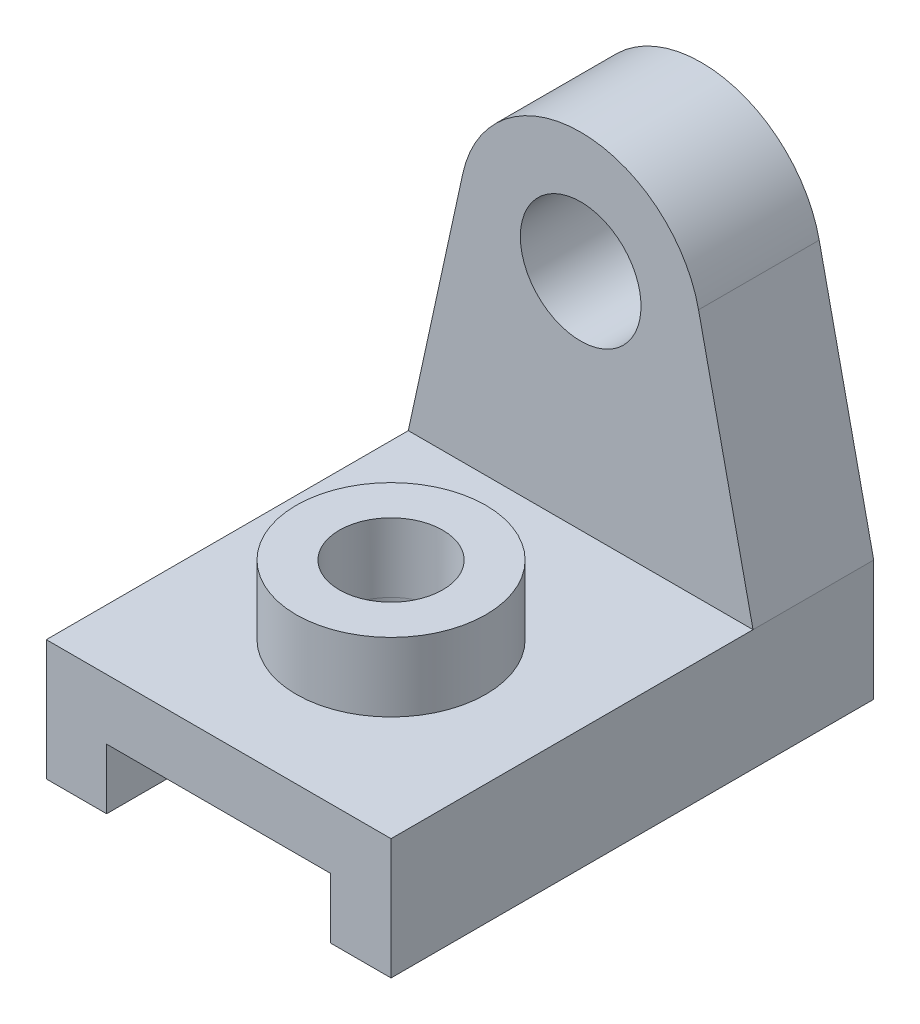
ISO-10303-21;
HEADER;
FILE_DESCRIPTION(('STEP AP214'),'2;1');
FILE_NAME('part.step','',(''),(''),'','','');
FILE_SCHEMA(('AUTOMOTIVE_DESIGN { 1 0 10303 214 1 1 1 1 }'));
ENDSEC;
DATA;
#1=APPLICATION_CONTEXT('core data for automotive mechanical design processes');
#2=APPLICATION_PROTOCOL_DEFINITION('international standard','automotive_design',2000,#1);
#3=PRODUCT_CONTEXT('',#1,'mechanical');
#4=PRODUCT('Part','Part','',(#3));
#5=PRODUCT_RELATED_PRODUCT_CATEGORY('part','',(#4));
#6=PRODUCT_DEFINITION_FORMATION('','',#4);
#7=PRODUCT_DEFINITION_CONTEXT('part definition',#1,'design');
#8=PRODUCT_DEFINITION('design','',#6,#7);
#9=PRODUCT_DEFINITION_SHAPE('','',#8);
#10=(LENGTH_UNIT() NAMED_UNIT(*) SI_UNIT(.MILLI.,.METRE.));
#11=(NAMED_UNIT(*) PLANE_ANGLE_UNIT() SI_UNIT($,.RADIAN.));
#12=(NAMED_UNIT(*) SI_UNIT($,.STERADIAN.) SOLID_ANGLE_UNIT());
#13=UNCERTAINTY_MEASURE_WITH_UNIT(LENGTH_MEASURE(1.E-05),#10,'distance_accuracy_value','');
#14=(GEOMETRIC_REPRESENTATION_CONTEXT(3) GLOBAL_UNCERTAINTY_ASSIGNED_CONTEXT((#13)) GLOBAL_UNIT_ASSIGNED_CONTEXT((#10,
#11,#12)) REPRESENTATION_CONTEXT('',''));
#15=CARTESIAN_POINT('',(0.,0.,0.));
#16=DIRECTION('',(0.,0.,1.));
#17=DIRECTION('',(1.,0.,0.));
#18=AXIS2_PLACEMENT_3D('',#15,#16,#17);
#19=CARTESIAN_POINT('',(20.,0.,-56.));
#20=DIRECTION('',(1.,0.,0.));
#21=DIRECTION('',(0.,0.,-1.));
#22=AXIS2_PLACEMENT_3D('',#19,#20,#21);
#23=PLANE('',#22);
#24=DIRECTION('',(0.,1.,0.));
#25=VECTOR('',#24,1.);
#26=CARTESIAN_POINT('',(20.,0.,0.));
#27=LINE('',#26,#25);
#28=CARTESIAN_POINT('',(20.,-14.,0.));
#29=VERTEX_POINT('',#28);
#30=CARTESIAN_POINT('',(20.,0.,0.));
#31=VERTEX_POINT('',#30);
#32=EDGE_CURVE('E179',#29,#31,#27,.T.);
#33=ORIENTED_EDGE('',*,*,#32,.F.);
#34=DIRECTION('',(0.,0.,1.));
#35=VECTOR('',#34,1.);
#36=CARTESIAN_POINT('',(20.,-14.,-56.));
#37=LINE('',#36,#35);
#38=CARTESIAN_POINT('',(20.,-14.,-56.));
#39=VERTEX_POINT('',#38);
#40=EDGE_CURVE('E45',#39,#29,#37,.T.);
#41=ORIENTED_EDGE('',*,*,#40,.F.);
#42=DIRECTION('',(0.,1.,0.));
#43=VECTOR('',#42,1.);
#44=CARTESIAN_POINT('',(20.,0.,-56.));
#45=LINE('',#44,#43);
#46=CARTESIAN_POINT('',(20.,0.,-56.));
#47=VERTEX_POINT('',#46);
#48=EDGE_CURVE('E128',#39,#47,#45,.T.);
#49=ORIENTED_EDGE('',*,*,#48,.T.);
#50=DIRECTION('',(0.,0.,1.));
#51=VECTOR('',#50,1.);
#52=CARTESIAN_POINT('',(20.,0.,-56.));
#53=LINE('',#52,#51);
#54=CARTESIAN_POINT('',(20.,0.,-42.));
#55=VERTEX_POINT('',#54);
#56=EDGE_CURVE('E123',#47,#55,#53,.T.);
#57=ORIENTED_EDGE('',*,*,#56,.T.);
#58=EDGE_CURVE('E125',#55,#31,#53,.T.);
#59=ORIENTED_EDGE('',*,*,#58,.T.);
#60=EDGE_LOOP('',(#33,#41,#49,#57,#59));
#61=FACE_BOUND('',#60,.T.);
#62=ADVANCED_FACE('F37',(#61),#23,.T.);
#63=CARTESIAN_POINT('',(20.,-14.,-56.));
#64=DIRECTION('',(0.,-1.,0.));
#65=DIRECTION('',(0.,0.,-1.));
#66=AXIS2_PLACEMENT_3D('',#63,#64,#65);
#67=PLANE('',#66);
#68=DIRECTION('',(1.,0.,0.));
#69=VECTOR('',#68,1.);
#70=CARTESIAN_POINT('',(20.,-14.,0.));
#71=LINE('',#70,#69);
#72=CARTESIAN_POINT('',(13.,-14.,0.));
#73=VERTEX_POINT('',#72);
#74=EDGE_CURVE('E183',#73,#29,#71,.T.);
#75=ORIENTED_EDGE('',*,*,#74,.F.);
#76=DIRECTION('',(0.,0.,1.));
#77=VECTOR('',#76,1.);
#78=CARTESIAN_POINT('',(13.,-14.,-56.));
#79=LINE('',#78,#77);
#80=CARTESIAN_POINT('',(13.,-14.,-56.));
#81=VERTEX_POINT('',#80);
#82=EDGE_CURVE('E220',#81,#73,#79,.T.);
#83=ORIENTED_EDGE('',*,*,#82,.F.);
#84=DIRECTION('',(1.,0.,0.));
#85=VECTOR('',#84,1.);
#86=CARTESIAN_POINT('',(20.,-14.,-56.));
#87=LINE('',#86,#85);
#88=EDGE_CURVE('E139',#81,#39,#87,.T.);
#89=ORIENTED_EDGE('',*,*,#88,.T.);
#90=ORIENTED_EDGE('',*,*,#40,.T.);
#91=EDGE_LOOP('',(#75,#83,#89,#90));
#92=FACE_BOUND('',#91,.T.);
#93=ADVANCED_FACE('F245',(#92),#67,.T.);
#94=CARTESIAN_POINT('',(13.,-14.,-56.));
#95=DIRECTION('',(-1.,0.,0.));
#96=DIRECTION('',(0.,0.,1.));
#97=AXIS2_PLACEMENT_3D('',#94,#95,#96);
#98=PLANE('',#97);
#99=DIRECTION('',(0.,-1.,0.));
#100=VECTOR('',#99,1.);
#101=CARTESIAN_POINT('',(13.,-14.,0.));
#102=LINE('',#101,#100);
#103=CARTESIAN_POINT('',(13.,-7.,0.));
#104=VERTEX_POINT('',#103);
#105=EDGE_CURVE('E214',#104,#73,#102,.T.);
#106=ORIENTED_EDGE('',*,*,#105,.F.);
#107=DIRECTION('',(0.,0.,1.));
#108=VECTOR('',#107,1.);
#109=CARTESIAN_POINT('',(13.,-7.,-56.));
#110=LINE('',#109,#108);
#111=CARTESIAN_POINT('',(13.,-7.,-56.));
#112=VERTEX_POINT('',#111);
#113=EDGE_CURVE('E222',#112,#104,#110,.T.);
#114=ORIENTED_EDGE('',*,*,#113,.F.);
#115=DIRECTION('',(0.,-1.,0.));
#116=VECTOR('',#115,1.);
#117=CARTESIAN_POINT('',(13.,-14.,-56.));
#118=LINE('',#117,#116);
#119=EDGE_CURVE('E195',#112,#81,#118,.T.);
#120=ORIENTED_EDGE('',*,*,#119,.T.);
#121=ORIENTED_EDGE('',*,*,#82,.T.);
#122=EDGE_LOOP('',(#106,#114,#120,#121));
#123=FACE_BOUND('',#122,.T.);
#124=ADVANCED_FACE('F248',(#123),#98,.T.);
#125=CARTESIAN_POINT('',(13.,-7.,-56.));
#126=DIRECTION('',(0.,-1.,0.));
#127=DIRECTION('',(0.,0.,-1.));
#128=AXIS2_PLACEMENT_3D('',#125,#126,#127);
#129=PLANE('',#128);
#130=CARTESIAN_POINT('',(0.,-7.,-19.9942415105449));
#131=DIRECTION('',(0.,-1.,0.));
#132=DIRECTION('',(0.,0.,-1.));
#133=AXIS2_PLACEMENT_3D('',#130,#131,#132);
#134=CIRCLE('',#133,6.00575848945509);
#135=CARTESIAN_POINT('',(0.,-7.,-26.));
#136=VERTEX_POINT('',#135);
#137=EDGE_CURVE('E40',#136,#136,#134,.T.);
#138=ORIENTED_EDGE('',*,*,#137,.F.);
#139=EDGE_LOOP('',(#138));
#140=FACE_BOUND('',#139,.T.);
#141=DIRECTION('',(1.,0.,0.));
#142=VECTOR('',#141,1.);
#143=CARTESIAN_POINT('',(13.,-7.,0.));
#144=LINE('',#143,#142);
#145=CARTESIAN_POINT('',(-13.,-7.,0.));
#146=VERTEX_POINT('',#145);
#147=EDGE_CURVE('E211',#146,#104,#144,.T.);
#148=ORIENTED_EDGE('',*,*,#147,.F.);
#149=DIRECTION('',(0.,0.,1.));
#150=VECTOR('',#149,1.);
#151=CARTESIAN_POINT('',(-13.,-7.,-56.));
#152=LINE('',#151,#150);
#153=CARTESIAN_POINT('',(-13.,-7.,-56.));
#154=VERTEX_POINT('',#153);
#155=EDGE_CURVE('E224',#154,#146,#152,.T.);
#156=ORIENTED_EDGE('',*,*,#155,.F.);
#157=DIRECTION('',(1.,0.,0.));
#158=VECTOR('',#157,1.);
#159=CARTESIAN_POINT('',(13.,-7.,-56.));
#160=LINE('',#159,#158);
#161=EDGE_CURVE('E192',#154,#112,#160,.T.);
#162=ORIENTED_EDGE('',*,*,#161,.T.);
#163=ORIENTED_EDGE('',*,*,#113,.T.);
#164=EDGE_LOOP('',(#148,#156,#162,#163));
#165=FACE_BOUND('',#164,.T.);
#166=ADVANCED_FACE('F253',(#140,#165),#129,.T.);
#167=CARTESIAN_POINT('',(-13.,-14.,-56.));
#168=DIRECTION('',(1.,0.,0.));
#169=DIRECTION('',(0.,0.,-1.));
#170=AXIS2_PLACEMENT_3D('',#167,#168,#169);
#171=PLANE('',#170);
#172=DIRECTION('',(0.,1.,0.));
#173=VECTOR('',#172,1.);
#174=CARTESIAN_POINT('',(-13.,-14.,0.));
#175=LINE('',#174,#173);
#176=CARTESIAN_POINT('',(-13.,-14.,0.));
#177=VERTEX_POINT('',#176);
#178=EDGE_CURVE('E208',#177,#146,#175,.T.);
#179=ORIENTED_EDGE('',*,*,#178,.F.);
#180=DIRECTION('',(0.,0.,1.));
#181=VECTOR('',#180,1.);
#182=CARTESIAN_POINT('',(-13.,-14.,-56.));
#183=LINE('',#182,#181);
#184=CARTESIAN_POINT('',(-13.,-14.,-56.));
#185=VERTEX_POINT('',#184);
#186=EDGE_CURVE('E226',#185,#177,#183,.T.);
#187=ORIENTED_EDGE('',*,*,#186,.F.);
#188=DIRECTION('',(0.,1.,0.));
#189=VECTOR('',#188,1.);
#190=CARTESIAN_POINT('',(-13.,-14.,-56.));
#191=LINE('',#190,#189);
#192=EDGE_CURVE('E189',#185,#154,#191,.T.);
#193=ORIENTED_EDGE('',*,*,#192,.T.);
#194=ORIENTED_EDGE('',*,*,#155,.T.);
#195=EDGE_LOOP('',(#179,#187,#193,#194));
#196=FACE_BOUND('',#195,.T.);
#197=ADVANCED_FACE('F256',(#196),#171,.T.);
#198=CARTESIAN_POINT('',(-20.,-14.,-56.));
#199=DIRECTION('',(0.,-1.,0.));
#200=DIRECTION('',(0.,0.,-1.));
#201=AXIS2_PLACEMENT_3D('',#198,#199,#200);
#202=PLANE('',#201);
#203=DIRECTION('',(1.,0.,0.));
#204=VECTOR('',#203,1.);
#205=CARTESIAN_POINT('',(-20.,-14.,0.));
#206=LINE('',#205,#204);
#207=CARTESIAN_POINT('',(-20.,-14.,0.));
#208=VERTEX_POINT('',#207);
#209=EDGE_CURVE('E205',#208,#177,#206,.T.);
#210=ORIENTED_EDGE('',*,*,#209,.F.);
#211=DIRECTION('',(0.,0.,1.));
#212=VECTOR('',#211,1.);
#213=CARTESIAN_POINT('',(-20.,-14.,-56.));
#214=LINE('',#213,#212);
#215=CARTESIAN_POINT('',(-20.,-14.,-56.));
#216=VERTEX_POINT('',#215);
#217=EDGE_CURVE('E228',#216,#208,#214,.T.);
#218=ORIENTED_EDGE('',*,*,#217,.F.);
#219=DIRECTION('',(1.,0.,0.));
#220=VECTOR('',#219,1.);
#221=CARTESIAN_POINT('',(-20.,-14.,-56.));
#222=LINE('',#221,#220);
#223=EDGE_CURVE('E186',#216,#185,#222,.T.);
#224=ORIENTED_EDGE('',*,*,#223,.T.);
#225=ORIENTED_EDGE('',*,*,#186,.T.);
#226=EDGE_LOOP('',(#210,#218,#224,#225));
#227=FACE_BOUND('',#226,.T.);
#228=ADVANCED_FACE('F260',(#227),#202,.T.);
#229=CARTESIAN_POINT('',(-20.,0.,-56.));
#230=DIRECTION('',(-1.,0.,0.));
#231=DIRECTION('',(0.,0.,1.));
#232=AXIS2_PLACEMENT_3D('',#229,#230,#231);
#233=PLANE('',#232);
#234=DIRECTION('',(0.,-1.,0.));
#235=VECTOR('',#234,1.);
#236=CARTESIAN_POINT('',(-20.,0.,0.));
#237=LINE('',#236,#235);
#238=CARTESIAN_POINT('',(-20.,0.,0.));
#239=VERTEX_POINT('',#238);
#240=EDGE_CURVE('E202',#239,#208,#237,.T.);
#241=ORIENTED_EDGE('',*,*,#240,.F.);
#242=DIRECTION('',(0.,0.,1.));
#243=VECTOR('',#242,1.);
#244=CARTESIAN_POINT('',(-20.,0.,-56.));
#245=LINE('',#244,#243);
#246=CARTESIAN_POINT('',(-20.,0.,-42.));
#247=VERTEX_POINT('',#246);
#248=EDGE_CURVE('E133',#247,#239,#245,.T.);
#249=ORIENTED_EDGE('',*,*,#248,.F.);
#250=CARTESIAN_POINT('',(-20.,0.,-56.));
#251=VERTEX_POINT('',#250);
#252=EDGE_CURVE('E230',#251,#247,#245,.T.);
#253=ORIENTED_EDGE('',*,*,#252,.F.);
#254=DIRECTION('',(0.,-1.,0.));
#255=VECTOR('',#254,1.);
#256=CARTESIAN_POINT('',(-20.,0.,-56.));
#257=LINE('',#256,#255);
#258=EDGE_CURVE('E182',#251,#216,#257,.T.);
#259=ORIENTED_EDGE('',*,*,#258,.T.);
#260=ORIENTED_EDGE('',*,*,#217,.T.);
#261=EDGE_LOOP('',(#241,#249,#253,#259,#260));
#262=FACE_BOUND('',#261,.T.);
#263=ADVANCED_FACE('F234',(#262),#233,.T.);
#264=CARTESIAN_POINT('',(-20.,0.,-56.));
#265=DIRECTION('',(0.,1.,0.));
#266=DIRECTION('',(0.,0.,1.));
#267=AXIS2_PLACEMENT_3D('',#264,#265,#266);
#268=PLANE('',#267);
#269=CARTESIAN_POINT('',(0.,0.,-20.));
#270=DIRECTION('',(0.,1.,0.));
#271=DIRECTION('',(0.,0.,1.));
#272=AXIS2_PLACEMENT_3D('',#269,#270,#271);
#273=CIRCLE('',#272,11.);
#274=CARTESIAN_POINT('',(0.,0.,-9.));
#275=VERTEX_POINT('',#274);
#276=EDGE_CURVE('E160',#275,#275,#273,.T.);
#277=ORIENTED_EDGE('',*,*,#276,.F.);
#278=EDGE_LOOP('',(#277));
#279=FACE_BOUND('',#278,.T.);
#280=DIRECTION('',(1.,0.,0.));
#281=VECTOR('',#280,1.);
#282=CARTESIAN_POINT('',(0.,0.,-42.));
#283=LINE('',#282,#281);
#284=EDGE_CURVE('E58',#247,#55,#283,.T.);
#285=ORIENTED_EDGE('',*,*,#284,.F.);
#286=ORIENTED_EDGE('',*,*,#248,.T.);
#287=DIRECTION('',(-1.,0.,0.));
#288=VECTOR('',#287,1.);
#289=CARTESIAN_POINT('',(-20.,0.,0.));
#290=LINE('',#289,#288);
#291=EDGE_CURVE('E137',#31,#239,#290,.T.);
#292=ORIENTED_EDGE('',*,*,#291,.F.);
#293=ORIENTED_EDGE('',*,*,#58,.F.);
#294=EDGE_LOOP('',(#285,#286,#292,#293));
#295=FACE_BOUND('',#294,.T.);
#296=ADVANCED_FACE('F135',(#279,#295),#268,.T.);
#297=CARTESIAN_POINT('',(0.,0.,-56.));
#298=DIRECTION('',(0.,0.,-1.));
#299=DIRECTION('',(-1.,0.,0.));
#300=AXIS2_PLACEMENT_3D('',#297,#298,#299);
#301=PLANE('',#300);
#302=ORIENTED_EDGE('',*,*,#48,.F.);
#303=ORIENTED_EDGE('',*,*,#88,.F.);
#304=ORIENTED_EDGE('',*,*,#119,.F.);
#305=ORIENTED_EDGE('',*,*,#161,.F.);
#306=ORIENTED_EDGE('',*,*,#192,.F.);
#307=ORIENTED_EDGE('',*,*,#223,.F.);
#308=ORIENTED_EDGE('',*,*,#258,.F.);
#309=DIRECTION('',(-0.213100259263618,-0.977030337042704,0.));
#310=VECTOR('',#309,1.);
#311=CARTESIAN_POINT('',(-19.0917655900356,4.1641083626444,-56.));
#312=LINE('',#311,#310);
#313=CARTESIAN_POINT('',(-13.6784247185978,28.9834036296907,-56.));
#314=VERTEX_POINT('',#313);
#315=EDGE_CURVE('E172',#314,#251,#312,.T.);
#316=ORIENTED_EDGE('',*,*,#315,.F.);
#317=CARTESIAN_POINT('',(0.,26.,-56.));
#318=DIRECTION('',(0.,0.,-1.));
#319=DIRECTION('',(-1.,0.,0.));
#320=AXIS2_PLACEMENT_3D('',#317,#318,#319);
#321=CIRCLE('',#320,14.);
#322=CARTESIAN_POINT('',(13.6784247185979,28.9834036296907,-56.));
#323=VERTEX_POINT('',#322);
#324=EDGE_CURVE('E157',#314,#323,#321,.T.);
#325=ORIENTED_EDGE('',*,*,#324,.T.);
#326=DIRECTION('',(0.213100259263618,-0.977030337042704,0.));
#327=VECTOR('',#326,1.);
#328=CARTESIAN_POINT('',(19.0917655900356,4.1641083626444,-56.));
#329=LINE('',#328,#327);
#330=EDGE_CURVE('E170',#323,#47,#329,.T.);
#331=ORIENTED_EDGE('',*,*,#330,.T.);
#332=EDGE_LOOP('',(#302,#303,#304,#305,#306,#307,#308,#316,#325,#331));
#333=FACE_BOUND('',#332,.T.);
#334=CARTESIAN_POINT('',(0.,26.,-56.));
#335=DIRECTION('',(0.,0.,-1.));
#336=DIRECTION('',(-1.,0.,0.));
#337=AXIS2_PLACEMENT_3D('',#334,#335,#336);
#338=CIRCLE('',#337,7.);
#339=CARTESIAN_POINT('',(-7.,26.,-56.));
#340=VERTEX_POINT('',#339);
#341=EDGE_CURVE('E154',#340,#340,#338,.T.);
#342=ORIENTED_EDGE('',*,*,#341,.F.);
#343=EDGE_LOOP('',(#342));
#344=FACE_BOUND('',#343,.T.);
#345=ADVANCED_FACE('F242',(#333,#344),#301,.T.);
#346=CARTESIAN_POINT('',(0.,0.,0.));
#347=DIRECTION('',(0.,0.,-1.));
#348=DIRECTION('',(-1.,0.,0.));
#349=AXIS2_PLACEMENT_3D('',#346,#347,#348);
#350=PLANE('',#349);
#351=ORIENTED_EDGE('',*,*,#32,.T.);
#352=ORIENTED_EDGE('',*,*,#291,.T.);
#353=ORIENTED_EDGE('',*,*,#240,.T.);
#354=ORIENTED_EDGE('',*,*,#209,.T.);
#355=ORIENTED_EDGE('',*,*,#178,.T.);
#356=ORIENTED_EDGE('',*,*,#147,.T.);
#357=ORIENTED_EDGE('',*,*,#105,.T.);
#358=ORIENTED_EDGE('',*,*,#74,.T.);
#359=EDGE_LOOP('',(#351,#352,#353,#354,#355,#356,#357,#358));
#360=FACE_BOUND('',#359,.T.);
#361=ADVANCED_FACE('F237',(#360),#350,.F.);
#362=CARTESIAN_POINT('',(19.0917655900356,4.1641083626444,-42.));
#363=DIRECTION('',(0.977030337042703,0.213100259263618,0.));
#364=DIRECTION('',(-0.213100259263618,0.977030337042704,0.));
#365=AXIS2_PLACEMENT_3D('',#362,#363,#364);
#366=PLANE('',#365);
#367=ORIENTED_EDGE('',*,*,#330,.F.);
#368=DIRECTION('',(0.,0.,-1.));
#369=VECTOR('',#368,1.);
#370=CARTESIAN_POINT('',(13.6784247185979,28.9834036296907,-42.));
#371=LINE('',#370,#369);
#372=CARTESIAN_POINT('',(13.6784247185979,28.9834036296907,-42.));
#373=VERTEX_POINT('',#372);
#374=EDGE_CURVE('E153',#373,#323,#371,.T.);
#375=ORIENTED_EDGE('',*,*,#374,.F.);
#376=DIRECTION('',(0.213100259263618,-0.977030337042704,0.));
#377=VECTOR('',#376,1.);
#378=CARTESIAN_POINT('',(19.0917655900356,4.1641083626444,-42.));
#379=LINE('',#378,#377);
#380=EDGE_CURVE('E146',#373,#55,#379,.T.);
#381=ORIENTED_EDGE('',*,*,#380,.T.);
#382=ORIENTED_EDGE('',*,*,#56,.F.);
#383=EDGE_LOOP('',(#367,#375,#381,#382));
#384=FACE_BOUND('',#383,.T.);
#385=ADVANCED_FACE('F152',(#384),#366,.T.);
#386=CARTESIAN_POINT('',(0.,26.,-42.));
#387=DIRECTION('',(0.,0.,-1.));
#388=DIRECTION('',(-1.,0.,0.));
#389=AXIS2_PLACEMENT_3D('',#386,#387,#388);
#390=CYLINDRICAL_SURFACE('',#389,14.);
#391=ORIENTED_EDGE('',*,*,#324,.F.);
#392=DIRECTION('',(0.,0.,-1.));
#393=VECTOR('',#392,1.);
#394=CARTESIAN_POINT('',(-13.6784247185978,28.9834036296907,-42.));
#395=LINE('',#394,#393);
#396=CARTESIAN_POINT('',(-13.6784247185978,28.9834036296907,-42.));
#397=VERTEX_POINT('',#396);
#398=EDGE_CURVE('E169',#397,#314,#395,.T.);
#399=ORIENTED_EDGE('',*,*,#398,.F.);
#400=CARTESIAN_POINT('',(0.,26.,-42.));
#401=DIRECTION('',(0.,0.,-1.));
#402=DIRECTION('',(-1.,0.,0.));
#403=AXIS2_PLACEMENT_3D('',#400,#401,#402);
#404=CIRCLE('',#403,14.);
#405=EDGE_CURVE('E164',#397,#373,#404,.T.);
#406=ORIENTED_EDGE('',*,*,#405,.T.);
#407=ORIENTED_EDGE('',*,*,#374,.T.);
#408=EDGE_LOOP('',(#391,#399,#406,#407));
#409=FACE_BOUND('',#408,.T.);
#410=ADVANCED_FACE('F311',(#409),#390,.T.);
#411=CARTESIAN_POINT('',(-19.0917655900356,4.1641083626444,-42.));
#412=DIRECTION('',(0.977030337042703,-0.213100259263618,0.));
#413=DIRECTION('',(0.213100259263618,0.977030337042704,0.));
#414=AXIS2_PLACEMENT_3D('',#411,#412,#413);
#415=PLANE('',#414);
#416=ORIENTED_EDGE('',*,*,#315,.T.);
#417=ORIENTED_EDGE('',*,*,#252,.T.);
#418=DIRECTION('',(-0.213100259263618,-0.977030337042704,0.));
#419=VECTOR('',#418,1.);
#420=CARTESIAN_POINT('',(-19.0917655900356,4.1641083626444,-42.));
#421=LINE('',#420,#419);
#422=EDGE_CURVE('E149',#397,#247,#421,.T.);
#423=ORIENTED_EDGE('',*,*,#422,.F.);
#424=ORIENTED_EDGE('',*,*,#398,.T.);
#425=EDGE_LOOP('',(#416,#417,#423,#424));
#426=FACE_BOUND('',#425,.T.);
#427=ADVANCED_FACE('F312',(#426),#415,.F.);
#428=CARTESIAN_POINT('',(0.,26.,-42.));
#429=DIRECTION('',(0.,0.,-1.));
#430=DIRECTION('',(-1.,0.,0.));
#431=AXIS2_PLACEMENT_3D('',#428,#429,#430);
#432=CYLINDRICAL_SURFACE('',#431,7.);
#433=CARTESIAN_POINT('',(0.,26.,-42.));
#434=DIRECTION('',(0.,0.,-1.));
#435=DIRECTION('',(-1.,0.,0.));
#436=AXIS2_PLACEMENT_3D('',#433,#434,#435);
#437=CIRCLE('',#436,7.);
#438=CARTESIAN_POINT('',(-7.,26.,-42.));
#439=VERTEX_POINT('',#438);
#440=EDGE_CURVE('E166',#439,#439,#437,.T.);
#441=ORIENTED_EDGE('',*,*,#440,.F.);
#442=EDGE_LOOP('',(#441));
#443=FACE_BOUND('',#442,.T.);
#444=ORIENTED_EDGE('',*,*,#341,.T.);
#445=EDGE_LOOP('',(#444));
#446=FACE_BOUND('',#445,.T.);
#447=ADVANCED_FACE('F315',(#443,#446),#432,.F.);
#448=CARTESIAN_POINT('',(0.,0.,-42.));
#449=DIRECTION('',(0.,0.,-1.));
#450=DIRECTION('',(-1.,0.,0.));
#451=AXIS2_PLACEMENT_3D('',#448,#449,#450);
#452=PLANE('',#451);
#453=ORIENTED_EDGE('',*,*,#380,.F.);
#454=ORIENTED_EDGE('',*,*,#405,.F.);
#455=ORIENTED_EDGE('',*,*,#422,.T.);
#456=ORIENTED_EDGE('',*,*,#284,.T.);
#457=EDGE_LOOP('',(#453,#454,#455,#456));
#458=FACE_BOUND('',#457,.T.);
#459=ORIENTED_EDGE('',*,*,#440,.T.);
#460=EDGE_LOOP('',(#459));
#461=FACE_BOUND('',#460,.T.);
#462=ADVANCED_FACE('F143',(#458,#461),#452,.F.);
#463=CARTESIAN_POINT('',(0.,8.,-20.));
#464=DIRECTION('',(0.,1.,0.));
#465=DIRECTION('',(0.,0.,1.));
#466=AXIS2_PLACEMENT_3D('',#463,#464,#465);
#467=PLANE('',#466);
#468=CARTESIAN_POINT('',(0.,8.,-20.));
#469=DIRECTION('',(0.,1.,0.));
#470=DIRECTION('',(0.,0.,1.));
#471=AXIS2_PLACEMENT_3D('',#468,#469,#470);
#472=CIRCLE('',#471,11.);
#473=CARTESIAN_POINT('',(0.,8.,-9.));
#474=VERTEX_POINT('',#473);
#475=EDGE_CURVE('E173',#474,#474,#472,.T.);
#476=ORIENTED_EDGE('',*,*,#475,.T.);
#477=EDGE_LOOP('',(#476));
#478=FACE_BOUND('',#477,.T.);
#479=CARTESIAN_POINT('',(0.,8.,-20.));
#480=DIRECTION('',(0.,1.,0.));
#481=DIRECTION('',(0.,0.,1.));
#482=AXIS2_PLACEMENT_3D('',#479,#480,#481);
#483=CIRCLE('',#482,6.);
#484=CARTESIAN_POINT('',(0.,8.,-14.));
#485=VERTEX_POINT('',#484);
#486=EDGE_CURVE('E288',#485,#485,#483,.T.);
#487=ORIENTED_EDGE('',*,*,#486,.F.);
#488=EDGE_LOOP('',(#487));
#489=FACE_BOUND('',#488,.T.);
#490=ADVANCED_FACE('F324',(#478,#489),#467,.T.);
#491=CARTESIAN_POINT('',(0.,8.,-20.));
#492=DIRECTION('',(0.,-1.,0.));
#493=DIRECTION('',(0.,0.,-1.));
#494=AXIS2_PLACEMENT_3D('',#491,#492,#493);
#495=CYLINDRICAL_SURFACE('',#494,11.);
#496=ORIENTED_EDGE('',*,*,#475,.F.);
#497=EDGE_LOOP('',(#496));
#498=FACE_BOUND('',#497,.T.);
#499=ORIENTED_EDGE('',*,*,#276,.T.);
#500=EDGE_LOOP('',(#499));
#501=FACE_BOUND('',#500,.T.);
#502=ADVANCED_FACE('F299',(#498,#501),#495,.T.);
#503=CARTESIAN_POINT('',(0.,8.,-20.));
#504=DIRECTION('',(0.,-1.,0.));
#505=DIRECTION('',(0.,0.,-1.));
#506=AXIS2_PLACEMENT_3D('',#503,#504,#505);
#507=CYLINDRICAL_SURFACE('',#506,6.);
#508=ORIENTED_EDGE('',*,*,#486,.T.);
#509=EDGE_LOOP('',(#508));
#510=FACE_BOUND('',#509,.T.);
#511=CARTESIAN_POINT('',(0.,0.,-20.));
#512=DIRECTION('',(0.,1.,0.));
#513=DIRECTION('',(0.,0.,1.));
#514=AXIS2_PLACEMENT_3D('',#511,#512,#513);
#515=CIRCLE('',#514,6.);
#516=CARTESIAN_POINT('',(0.,0.,-26.));
#517=VERTEX_POINT('',#516);
#518=EDGE_CURVE('E11',#517,#517,#515,.F.);
#519=ORIENTED_EDGE('',*,*,#518,.T.);
#520=EDGE_LOOP('',(#519));
#521=FACE_BOUND('',#520,.T.);
#522=ADVANCED_FACE('F327',(#510,#521),#507,.F.);
#523=CARTESIAN_POINT('',(0.,0.,-19.9942415105449));
#524=DIRECTION('',(0.,1.,0.));
#525=DIRECTION('',(0.,0.,1.));
#526=AXIS2_PLACEMENT_3D('',#523,#524,#525);
#527=PLANE('',#526);
#528=CARTESIAN_POINT('',(0.,0.,-19.9942415105449));
#529=DIRECTION('',(0.,1.,0.));
#530=DIRECTION('',(0.,0.,1.));
#531=AXIS2_PLACEMENT_3D('',#528,#529,#530);
#532=CIRCLE('',#531,6.00575848945509);
#533=EDGE_CURVE('E51',#517,#517,#532,.T.);
#534=ORIENTED_EDGE('',*,*,#533,.F.);
#535=ORIENTED_EDGE('',*,*,#518,.F.);
#536=EDGE_LOOP('',(#534,#535));
#537=FACE_BOUND('',#536,.T.);
#538=ADVANCED_FACE('F333',(#537),#527,.F.);
#539=CARTESIAN_POINT('',(0.,-10.,-19.9942415105449));
#540=DIRECTION('',(0.,1.,0.));
#541=DIRECTION('',(0.,0.,1.));
#542=AXIS2_PLACEMENT_3D('',#539,#540,#541);
#543=CYLINDRICAL_SURFACE('',#542,6.00575848945509);
#544=ORIENTED_EDGE('',*,*,#137,.T.);
#545=EDGE_LOOP('',(#544));
#546=FACE_BOUND('',#545,.T.);
#547=ORIENTED_EDGE('',*,*,#533,.T.);
#548=EDGE_LOOP('',(#547));
#549=FACE_BOUND('',#548,.T.);
#550=ADVANCED_FACE('F335',(#546,#549),#543,.F.);
#551=CLOSED_SHELL('',(#62,#93,#124,#166,#197,#228,#263,#296,#345,#361,#385,#410,#427,#447,#462,
#490,#502,#522,#538,#550));
#552=MANIFOLD_SOLID_BREP('B2',#551);
#553=ADVANCED_BREP_SHAPE_REPRESENTATION('',(#18,#552),#14);
#554=SHAPE_DEFINITION_REPRESENTATION(#9,#553);
ENDSEC;
END-ISO-10303-21;
